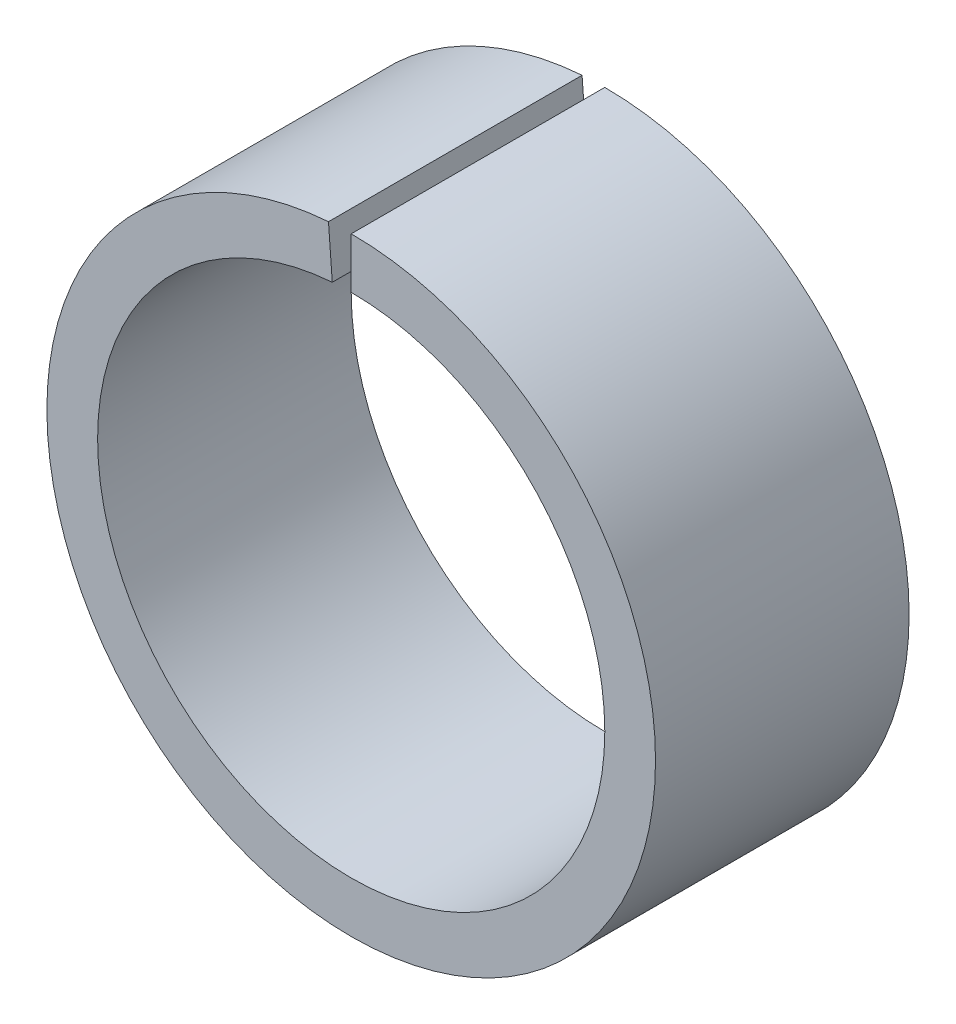
ISO-10303-21;
HEADER;
FILE_DESCRIPTION(('STEP AP214'),'2;1');
FILE_NAME('part.step','',(''),(''),'','','');
FILE_SCHEMA(('AUTOMOTIVE_DESIGN { 1 0 10303 214 1 1 1 1 }'));
ENDSEC;
DATA;
#1=APPLICATION_CONTEXT('core data for automotive mechanical design processes');
#2=APPLICATION_PROTOCOL_DEFINITION('international standard','automotive_design',2000,#1);
#3=PRODUCT_CONTEXT('',#1,'mechanical');
#4=PRODUCT('Part','Part','',(#3));
#5=PRODUCT_RELATED_PRODUCT_CATEGORY('part','',(#4));
#6=PRODUCT_DEFINITION_FORMATION('','',#4);
#7=PRODUCT_DEFINITION_CONTEXT('part definition',#1,'design');
#8=PRODUCT_DEFINITION('design','',#6,#7);
#9=PRODUCT_DEFINITION_SHAPE('','',#8);
#10=(LENGTH_UNIT() NAMED_UNIT(*) SI_UNIT(.MILLI.,.METRE.));
#11=(NAMED_UNIT(*) PLANE_ANGLE_UNIT() SI_UNIT($,.RADIAN.));
#12=(NAMED_UNIT(*) SI_UNIT($,.STERADIAN.) SOLID_ANGLE_UNIT());
#13=UNCERTAINTY_MEASURE_WITH_UNIT(LENGTH_MEASURE(1.E-05),#10,'distance_accuracy_value','');
#14=(GEOMETRIC_REPRESENTATION_CONTEXT(3) GLOBAL_UNCERTAINTY_ASSIGNED_CONTEXT((#13)) GLOBAL_UNIT_ASSIGNED_CONTEXT((#10,
#11,#12)) REPRESENTATION_CONTEXT('',''));
#15=CARTESIAN_POINT('',(0.,0.,0.));
#16=DIRECTION('',(0.,0.,1.));
#17=DIRECTION('',(1.,0.,0.));
#18=AXIS2_PLACEMENT_3D('',#15,#16,#17);
#19=CARTESIAN_POINT('',(0.,0.,5.));
#20=DIRECTION('',(0.,0.,1.));
#21=DIRECTION('',(1.,0.,0.));
#22=AXIS2_PLACEMENT_3D('',#19,#20,#21);
#23=PLANE('',#22);
#24=DIRECTION('',(0.0746206323219754,-0.997211994127562,0.));
#25=VECTOR('',#24,1.);
#26=CARTESIAN_POINT('',(-0.806504288675569,10.7779272964663,5.));
#27=LINE('',#26,#25);
#28=CARTESIAN_POINT('',(-0.447723793931853,5.98327196476537,5.));
#29=VERTEX_POINT('',#28);
#30=CARTESIAN_POINT('',(-0.373103161609877,4.98605997063781,5.));
#31=VERTEX_POINT('',#30);
#32=EDGE_CURVE('E60',#29,#31,#27,.T.);
#33=ORIENTED_EDGE('',*,*,#32,.F.);
#34=CARTESIAN_POINT('',(0.,0.,5.));
#35=DIRECTION('',(0.,0.,1.));
#36=DIRECTION('',(1.,0.,0.));
#37=AXIS2_PLACEMENT_3D('',#34,#35,#36);
#38=CIRCLE('',#37,6.);
#39=CARTESIAN_POINT('',(0.,6.,5.));
#40=VERTEX_POINT('',#39);
#41=EDGE_CURVE('E90',#29,#40,#38,.T.);
#42=ORIENTED_EDGE('',*,*,#41,.T.);
#43=DIRECTION('',(0.,1.,0.));
#44=VECTOR('',#43,1.);
#45=CARTESIAN_POINT('',(0.,0.,5.));
#46=LINE('',#45,#44);
#47=CARTESIAN_POINT('',(0.,5.,5.));
#48=VERTEX_POINT('',#47);
#49=EDGE_CURVE('E93',#48,#40,#46,.T.);
#50=ORIENTED_EDGE('',*,*,#49,.F.);
#51=CARTESIAN_POINT('',(0.,0.,5.));
#52=DIRECTION('',(0.,0.,1.));
#53=DIRECTION('',(1.,0.,0.));
#54=AXIS2_PLACEMENT_3D('',#51,#52,#53);
#55=CIRCLE('',#54,5.);
#56=EDGE_CURVE('E92',#31,#48,#55,.T.);
#57=ORIENTED_EDGE('',*,*,#56,.F.);
#58=EDGE_LOOP('',(#33,#42,#50,#57));
#59=FACE_BOUND('',#58,.T.);
#60=ADVANCED_FACE('F38',(#59),#23,.T.);
#61=CARTESIAN_POINT('',(0.,0.,0.));
#62=DIRECTION('',(0.,0.,1.));
#63=DIRECTION('',(1.,0.,0.));
#64=AXIS2_PLACEMENT_3D('',#61,#62,#63);
#65=PLANE('',#64);
#66=CARTESIAN_POINT('',(0.,0.,0.));
#67=DIRECTION('',(0.,0.,1.));
#68=DIRECTION('',(1.,0.,0.));
#69=AXIS2_PLACEMENT_3D('',#66,#67,#68);
#70=CIRCLE('',#69,6.);
#71=CARTESIAN_POINT('',(-0.447723793931852,5.98327196476537,0.));
#72=VERTEX_POINT('',#71);
#73=CARTESIAN_POINT('',(0.,6.,0.));
#74=VERTEX_POINT('',#73);
#75=EDGE_CURVE('E97',#72,#74,#70,.T.);
#76=ORIENTED_EDGE('',*,*,#75,.F.);
#77=DIRECTION('',(0.0746206323219754,-0.997211994127562,0.));
#78=VECTOR('',#77,1.);
#79=CARTESIAN_POINT('',(0.,0.,0.));
#80=LINE('',#79,#78);
#81=CARTESIAN_POINT('',(-0.373103161609877,4.98605997063781,0.));
#82=VERTEX_POINT('',#81);
#83=EDGE_CURVE('E79',#72,#82,#80,.T.);
#84=ORIENTED_EDGE('',*,*,#83,.T.);
#85=CARTESIAN_POINT('',(0.,0.,0.));
#86=DIRECTION('',(0.,0.,1.));
#87=DIRECTION('',(1.,0.,0.));
#88=AXIS2_PLACEMENT_3D('',#85,#86,#87);
#89=CIRCLE('',#88,5.);
#90=CARTESIAN_POINT('',(0.,5.,0.));
#91=VERTEX_POINT('',#90);
#92=EDGE_CURVE('E84',#82,#91,#89,.T.);
#93=ORIENTED_EDGE('',*,*,#92,.T.);
#94=DIRECTION('',(0.,1.,0.));
#95=VECTOR('',#94,1.);
#96=CARTESIAN_POINT('',(0.,0.,0.));
#97=LINE('',#96,#95);
#98=EDGE_CURVE('E53',#91,#74,#97,.T.);
#99=ORIENTED_EDGE('',*,*,#98,.T.);
#100=EDGE_LOOP('',(#76,#84,#93,#99));
#101=FACE_BOUND('',#100,.T.);
#102=ADVANCED_FACE('F112',(#101),#65,.F.);
#103=CARTESIAN_POINT('',(0.,0.,5.));
#104=DIRECTION('',(0.,0.,-1.));
#105=DIRECTION('',(-1.,0.,0.));
#106=AXIS2_PLACEMENT_3D('',#103,#104,#105);
#107=CYLINDRICAL_SURFACE('',#106,6.);
#108=ORIENTED_EDGE('',*,*,#41,.F.);
#109=DIRECTION('',(0.,0.,-1.));
#110=VECTOR('',#109,1.);
#111=CARTESIAN_POINT('',(-0.447723793931852,5.98327196476537,5.));
#112=LINE('',#111,#110);
#113=EDGE_CURVE('E76',#29,#72,#112,.T.);
#114=ORIENTED_EDGE('',*,*,#113,.T.);
#115=ORIENTED_EDGE('',*,*,#75,.T.);
#116=DIRECTION('',(0.,0.,-1.));
#117=VECTOR('',#116,1.);
#118=CARTESIAN_POINT('',(0.,6.,5.));
#119=LINE('',#118,#117);
#120=EDGE_CURVE('E96',#74,#40,#119,.F.);
#121=ORIENTED_EDGE('',*,*,#120,.T.);
#122=EDGE_LOOP('',(#108,#114,#115,#121));
#123=FACE_BOUND('',#122,.T.);
#124=ADVANCED_FACE('F40',(#123),#107,.T.);
#125=CARTESIAN_POINT('',(0.,0.,5.));
#126=DIRECTION('',(0.,0.,-1.));
#127=DIRECTION('',(-1.,0.,0.));
#128=AXIS2_PLACEMENT_3D('',#125,#126,#127);
#129=CYLINDRICAL_SURFACE('',#128,5.);
#130=DIRECTION('',(0.,0.,-1.));
#131=VECTOR('',#130,1.);
#132=CARTESIAN_POINT('',(-0.373103161609877,4.98605997063781,5.));
#133=LINE('',#132,#131);
#134=EDGE_CURVE('E11',#31,#82,#133,.T.);
#135=ORIENTED_EDGE('',*,*,#134,.F.);
#136=ORIENTED_EDGE('',*,*,#56,.T.);
#137=DIRECTION('',(0.,0.,-1.));
#138=VECTOR('',#137,1.);
#139=CARTESIAN_POINT('',(0.,5.,5.));
#140=LINE('',#139,#138);
#141=EDGE_CURVE('E46',#91,#48,#140,.F.);
#142=ORIENTED_EDGE('',*,*,#141,.F.);
#143=ORIENTED_EDGE('',*,*,#92,.F.);
#144=EDGE_LOOP('',(#135,#136,#142,#143));
#145=FACE_BOUND('',#144,.T.);
#146=ADVANCED_FACE('F109',(#145),#129,.F.);
#147=CARTESIAN_POINT('',(0.,0.,-5.));
#148=DIRECTION('',(1.,0.,0.));
#149=DIRECTION('',(0.,0.,-1.));
#150=AXIS2_PLACEMENT_3D('',#147,#148,#149);
#151=PLANE('',#150);
#152=ORIENTED_EDGE('',*,*,#98,.F.);
#153=ORIENTED_EDGE('',*,*,#141,.T.);
#154=ORIENTED_EDGE('',*,*,#49,.T.);
#155=ORIENTED_EDGE('',*,*,#120,.F.);
#156=EDGE_LOOP('',(#152,#153,#154,#155));
#157=FACE_BOUND('',#156,.T.);
#158=ADVANCED_FACE('F107',(#157),#151,.F.);
#159=CARTESIAN_POINT('',(-0.806504288675569,10.7779272964663,-5.));
#160=DIRECTION('',(-0.997211994127562,-0.0746206323219754,0.));
#161=DIRECTION('',(0.0746206323219754,-0.997211994127562,0.));
#162=AXIS2_PLACEMENT_3D('',#159,#160,#161);
#163=PLANE('',#162);
#164=ORIENTED_EDGE('',*,*,#32,.T.);
#165=ORIENTED_EDGE('',*,*,#134,.T.);
#166=ORIENTED_EDGE('',*,*,#83,.F.);
#167=ORIENTED_EDGE('',*,*,#113,.F.);
#168=EDGE_LOOP('',(#164,#165,#166,#167));
#169=FACE_BOUND('',#168,.T.);
#170=ADVANCED_FACE('F77',(#169),#163,.F.);
#171=CLOSED_SHELL('',(#60,#102,#124,#146,#158,#170));
#172=MANIFOLD_SOLID_BREP('B2',#171);
#173=ADVANCED_BREP_SHAPE_REPRESENTATION('',(#18,#172),#14);
#174=SHAPE_DEFINITION_REPRESENTATION(#9,#173);
ENDSEC;
END-ISO-10303-21;
